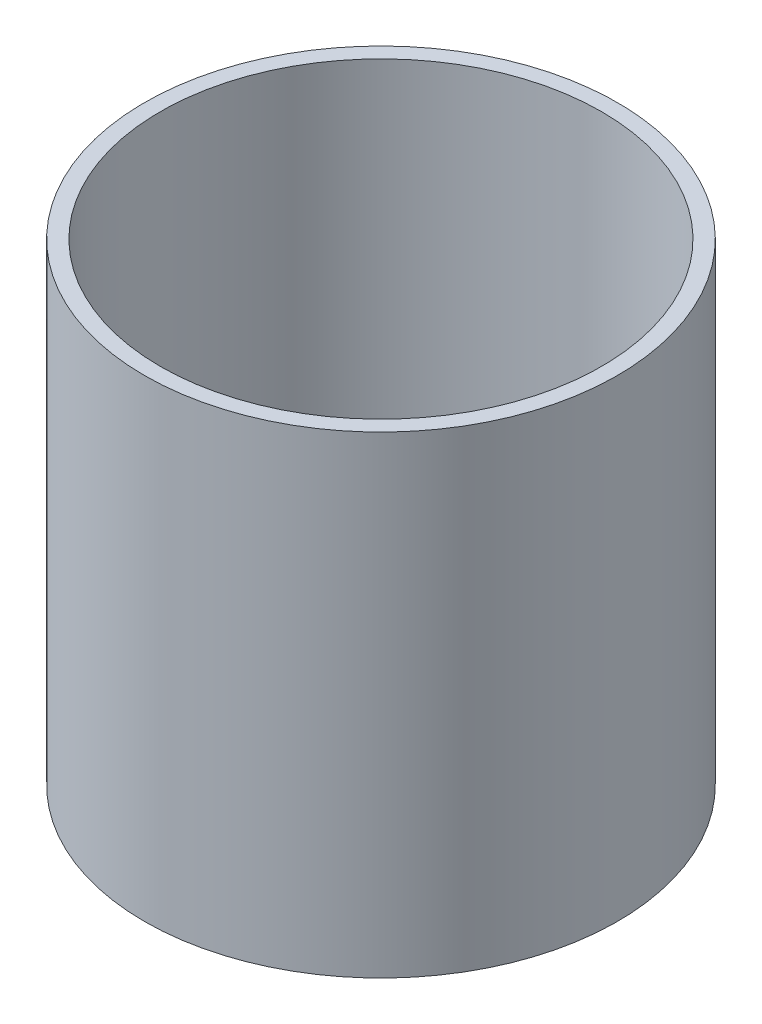
ISO-10303-21;
HEADER;
FILE_DESCRIPTION(('STEP AP214'),'2;1');
FILE_NAME('part.step','',(''),(''),'','','');
FILE_SCHEMA(('AUTOMOTIVE_DESIGN { 1 0 10303 214 1 1 1 1 }'));
ENDSEC;
DATA;
#1=APPLICATION_CONTEXT('core data for automotive mechanical design processes');
#2=APPLICATION_PROTOCOL_DEFINITION('international standard','automotive_design',2000,#1);
#3=PRODUCT_CONTEXT('',#1,'mechanical');
#4=PRODUCT('Part','Part','',(#3));
#5=PRODUCT_RELATED_PRODUCT_CATEGORY('part','',(#4));
#6=PRODUCT_DEFINITION_FORMATION('','',#4);
#7=PRODUCT_DEFINITION_CONTEXT('part definition',#1,'design');
#8=PRODUCT_DEFINITION('design','',#6,#7);
#9=PRODUCT_DEFINITION_SHAPE('','',#8);
#10=(LENGTH_UNIT() NAMED_UNIT(*) SI_UNIT(.MILLI.,.METRE.));
#11=(NAMED_UNIT(*) PLANE_ANGLE_UNIT() SI_UNIT($,.RADIAN.));
#12=(NAMED_UNIT(*) SI_UNIT($,.STERADIAN.) SOLID_ANGLE_UNIT());
#13=UNCERTAINTY_MEASURE_WITH_UNIT(LENGTH_MEASURE(1.E-05),#10,'distance_accuracy_value','');
#14=(GEOMETRIC_REPRESENTATION_CONTEXT(3) GLOBAL_UNCERTAINTY_ASSIGNED_CONTEXT((#13)) GLOBAL_UNIT_ASSIGNED_CONTEXT((#10,
#11,#12)) REPRESENTATION_CONTEXT('',''));
#15=CARTESIAN_POINT('',(0.,0.,0.));
#16=DIRECTION('',(0.,0.,1.));
#17=DIRECTION('',(1.,0.,0.));
#18=AXIS2_PLACEMENT_3D('',#15,#16,#17);
#19=CARTESIAN_POINT('',(0.,75.,0.));
#20=DIRECTION('',(0.,-1.,0.));
#21=DIRECTION('',(0.,0.,-1.));
#22=AXIS2_PLACEMENT_3D('',#19,#20,#21);
#23=CYLINDRICAL_SURFACE('',#22,75.);
#24=CARTESIAN_POINT('',(0.,75.,0.));
#25=DIRECTION('',(0.,1.,0.));
#26=DIRECTION('',(0.,0.,1.));
#27=AXIS2_PLACEMENT_3D('',#24,#25,#26);
#28=CIRCLE('',#27,75.);
#29=CARTESIAN_POINT('',(0.,75.,75.));
#30=VERTEX_POINT('',#29);
#31=EDGE_CURVE('E10',#30,#30,#28,.T.);
#32=ORIENTED_EDGE('',*,*,#31,.F.);
#33=EDGE_LOOP('',(#32));
#34=FACE_BOUND('',#33,.T.);
#35=CARTESIAN_POINT('',(0.,-75.,0.));
#36=DIRECTION('',(0.,1.,0.));
#37=DIRECTION('',(0.,0.,1.));
#38=AXIS2_PLACEMENT_3D('',#35,#36,#37);
#39=CIRCLE('',#38,75.);
#40=CARTESIAN_POINT('',(0.,-75.,75.));
#41=VERTEX_POINT('',#40);
#42=EDGE_CURVE('E38',#41,#41,#39,.T.);
#43=ORIENTED_EDGE('',*,*,#42,.T.);
#44=EDGE_LOOP('',(#43));
#45=FACE_BOUND('',#44,.T.);
#46=ADVANCED_FACE('F31',(#34,#45),#23,.T.);
#47=CARTESIAN_POINT('',(0.,75.,0.));
#48=DIRECTION('',(0.,1.,0.));
#49=DIRECTION('',(0.,0.,1.));
#50=AXIS2_PLACEMENT_3D('',#47,#48,#49);
#51=PLANE('',#50);
#52=CARTESIAN_POINT('',(0.,75.,0.));
#53=DIRECTION('',(0.,1.,0.));
#54=DIRECTION('',(0.,0.,1.));
#55=AXIS2_PLACEMENT_3D('',#52,#53,#54);
#56=CIRCLE('',#55,70.);
#57=CARTESIAN_POINT('',(0.,75.,70.));
#58=VERTEX_POINT('',#57);
#59=EDGE_CURVE('E44',#58,#58,#56,.T.);
#60=ORIENTED_EDGE('',*,*,#59,.F.);
#61=EDGE_LOOP('',(#60));
#62=FACE_BOUND('',#61,.T.);
#63=ORIENTED_EDGE('',*,*,#31,.T.);
#64=EDGE_LOOP('',(#63));
#65=FACE_BOUND('',#64,.T.);
#66=ADVANCED_FACE('F56',(#62,#65),#51,.T.);
#67=CARTESIAN_POINT('',(0.,-75.,0.));
#68=DIRECTION('',(0.,1.,0.));
#69=DIRECTION('',(0.,0.,1.));
#70=AXIS2_PLACEMENT_3D('',#67,#68,#69);
#71=PLANE('',#70);
#72=CARTESIAN_POINT('',(0.,-75.,0.));
#73=DIRECTION('',(0.,1.,0.));
#74=DIRECTION('',(0.,0.,1.));
#75=AXIS2_PLACEMENT_3D('',#72,#73,#74);
#76=CIRCLE('',#75,70.);
#77=CARTESIAN_POINT('',(0.,-75.,70.));
#78=VERTEX_POINT('',#77);
#79=EDGE_CURVE('E34',#78,#78,#76,.F.);
#80=ORIENTED_EDGE('',*,*,#79,.F.);
#81=EDGE_LOOP('',(#80));
#82=FACE_BOUND('',#81,.T.);
#83=ORIENTED_EDGE('',*,*,#42,.F.);
#84=EDGE_LOOP('',(#83));
#85=FACE_BOUND('',#84,.T.);
#86=ADVANCED_FACE('F53',(#82,#85),#71,.F.);
#87=CARTESIAN_POINT('',(0.,75.,0.));
#88=DIRECTION('',(0.,-1.,0.));
#89=DIRECTION('',(0.,0.,-1.));
#90=AXIS2_PLACEMENT_3D('',#87,#88,#89);
#91=CYLINDRICAL_SURFACE('',#90,70.);
#92=ORIENTED_EDGE('',*,*,#59,.T.);
#93=EDGE_LOOP('',(#92));
#94=FACE_BOUND('',#93,.T.);
#95=ORIENTED_EDGE('',*,*,#79,.T.);
#96=EDGE_LOOP('',(#95));
#97=FACE_BOUND('',#96,.T.);
#98=ADVANCED_FACE('F51',(#94,#97),#91,.F.);
#99=CLOSED_SHELL('',(#46,#66,#86,#98));
#100=MANIFOLD_SOLID_BREP('B2',#99);
#101=ADVANCED_BREP_SHAPE_REPRESENTATION('',(#18,#100),#14);
#102=SHAPE_DEFINITION_REPRESENTATION(#9,#101);
ENDSEC;
END-ISO-10303-21;
